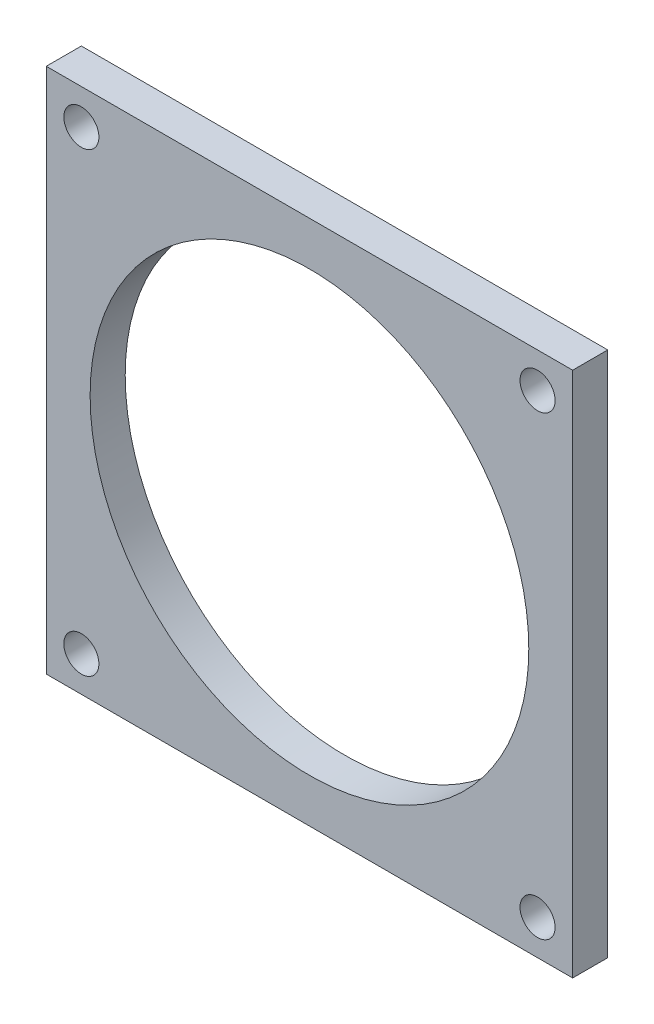
ISO-10303-21;
HEADER;
FILE_DESCRIPTION(('STEP AP214'),'2;1');
FILE_NAME('part.step','',(''),(''),'','','');
FILE_SCHEMA(('AUTOMOTIVE_DESIGN { 1 0 10303 214 1 1 1 1 }'));
ENDSEC;
DATA;
#1=APPLICATION_CONTEXT('core data for automotive mechanical design processes');
#2=APPLICATION_PROTOCOL_DEFINITION('international standard','automotive_design',2000,#1);
#3=PRODUCT_CONTEXT('',#1,'mechanical');
#4=PRODUCT('Part','Part','',(#3));
#5=PRODUCT_RELATED_PRODUCT_CATEGORY('part','',(#4));
#6=PRODUCT_DEFINITION_FORMATION('','',#4);
#7=PRODUCT_DEFINITION_CONTEXT('part definition',#1,'design');
#8=PRODUCT_DEFINITION('design','',#6,#7);
#9=PRODUCT_DEFINITION_SHAPE('','',#8);
#10=(LENGTH_UNIT() NAMED_UNIT(*) SI_UNIT(.MILLI.,.METRE.));
#11=(NAMED_UNIT(*) PLANE_ANGLE_UNIT() SI_UNIT($,.RADIAN.));
#12=(NAMED_UNIT(*) SI_UNIT($,.STERADIAN.) SOLID_ANGLE_UNIT());
#13=UNCERTAINTY_MEASURE_WITH_UNIT(LENGTH_MEASURE(1.E-05),#10,'distance_accuracy_value','');
#14=(GEOMETRIC_REPRESENTATION_CONTEXT(3) GLOBAL_UNCERTAINTY_ASSIGNED_CONTEXT((#13)) GLOBAL_UNIT_ASSIGNED_CONTEXT((#10,
#11,#12)) REPRESENTATION_CONTEXT('',''));
#15=CARTESIAN_POINT('',(0.,0.,0.));
#16=DIRECTION('',(0.,0.,1.));
#17=DIRECTION('',(1.,0.,0.));
#18=AXIS2_PLACEMENT_3D('',#15,#16,#17);
#19=CARTESIAN_POINT('',(-19.05,-19.05,2.54));
#20=DIRECTION('',(1.,0.,0.));
#21=DIRECTION('',(0.,0.,-1.));
#22=AXIS2_PLACEMENT_3D('',#19,#20,#21);
#23=PLANE('',#22);
#24=DIRECTION('',(0.,-1.,0.));
#25=VECTOR('',#24,1.);
#26=CARTESIAN_POINT('',(-19.05,-19.05,0.));
#27=LINE('',#26,#25);
#28=CARTESIAN_POINT('',(-19.05,19.05,0.));
#29=VERTEX_POINT('',#28);
#30=CARTESIAN_POINT('',(-19.05,-19.05,0.));
#31=VERTEX_POINT('',#30);
#32=EDGE_CURVE('E96',#29,#31,#27,.T.);
#33=ORIENTED_EDGE('',*,*,#32,.T.);
#34=DIRECTION('',(0.,0.,-1.));
#35=VECTOR('',#34,1.);
#36=CARTESIAN_POINT('',(-19.05,-19.05,2.54));
#37=LINE('',#36,#35);
#38=CARTESIAN_POINT('',(-19.05,-19.05,2.54));
#39=VERTEX_POINT('',#38);
#40=EDGE_CURVE('E11',#39,#31,#37,.T.);
#41=ORIENTED_EDGE('',*,*,#40,.F.);
#42=DIRECTION('',(0.,-1.,0.));
#43=VECTOR('',#42,1.);
#44=CARTESIAN_POINT('',(-19.05,-19.05,2.54));
#45=LINE('',#44,#43);
#46=CARTESIAN_POINT('',(-19.05,19.05,2.54));
#47=VERTEX_POINT('',#46);
#48=EDGE_CURVE('E84',#47,#39,#45,.T.);
#49=ORIENTED_EDGE('',*,*,#48,.F.);
#50=DIRECTION('',(0.,0.,-1.));
#51=VECTOR('',#50,1.);
#52=CARTESIAN_POINT('',(-19.05,19.05,2.54));
#53=LINE('',#52,#51);
#54=EDGE_CURVE('E92',#47,#29,#53,.T.);
#55=ORIENTED_EDGE('',*,*,#54,.T.);
#56=EDGE_LOOP('',(#33,#41,#49,#55));
#57=FACE_BOUND('',#56,.T.);
#58=ADVANCED_FACE('F33',(#57),#23,.F.);
#59=CARTESIAN_POINT('',(19.05,-19.05,2.54));
#60=DIRECTION('',(0.,1.,0.));
#61=DIRECTION('',(0.,0.,1.));
#62=AXIS2_PLACEMENT_3D('',#59,#60,#61);
#63=PLANE('',#62);
#64=DIRECTION('',(1.,0.,0.));
#65=VECTOR('',#64,1.);
#66=CARTESIAN_POINT('',(19.05,-19.05,0.));
#67=LINE('',#66,#65);
#68=CARTESIAN_POINT('',(19.05,-19.05,0.));
#69=VERTEX_POINT('',#68);
#70=EDGE_CURVE('E88',#31,#69,#67,.T.);
#71=ORIENTED_EDGE('',*,*,#70,.T.);
#72=DIRECTION('',(0.,0.,-1.));
#73=VECTOR('',#72,1.);
#74=CARTESIAN_POINT('',(19.05,-19.05,2.54));
#75=LINE('',#74,#73);
#76=CARTESIAN_POINT('',(19.05,-19.05,2.54));
#77=VERTEX_POINT('',#76);
#78=EDGE_CURVE('E41',#77,#69,#75,.T.);
#79=ORIENTED_EDGE('',*,*,#78,.F.);
#80=DIRECTION('',(1.,0.,0.));
#81=VECTOR('',#80,1.);
#82=CARTESIAN_POINT('',(19.05,-19.05,2.54));
#83=LINE('',#82,#81);
#84=EDGE_CURVE('E79',#39,#77,#83,.T.);
#85=ORIENTED_EDGE('',*,*,#84,.F.);
#86=ORIENTED_EDGE('',*,*,#40,.T.);
#87=EDGE_LOOP('',(#71,#79,#85,#86));
#88=FACE_BOUND('',#87,.T.);
#89=ADVANCED_FACE('F87',(#88),#63,.F.);
#90=CARTESIAN_POINT('',(19.05,19.05,2.54));
#91=DIRECTION('',(-1.,0.,0.));
#92=DIRECTION('',(0.,0.,1.));
#93=AXIS2_PLACEMENT_3D('',#90,#91,#92);
#94=PLANE('',#93);
#95=DIRECTION('',(0.,1.,0.));
#96=VECTOR('',#95,1.);
#97=CARTESIAN_POINT('',(19.05,19.05,0.));
#98=LINE('',#97,#96);
#99=CARTESIAN_POINT('',(19.05,19.05,0.));
#100=VERTEX_POINT('',#99);
#101=EDGE_CURVE('E66',#69,#100,#98,.T.);
#102=ORIENTED_EDGE('',*,*,#101,.T.);
#103=DIRECTION('',(0.,0.,-1.));
#104=VECTOR('',#103,1.);
#105=CARTESIAN_POINT('',(19.05,19.05,2.54));
#106=LINE('',#105,#104);
#107=CARTESIAN_POINT('',(19.05,19.05,2.54));
#108=VERTEX_POINT('',#107);
#109=EDGE_CURVE('E89',#108,#100,#106,.T.);
#110=ORIENTED_EDGE('',*,*,#109,.F.);
#111=DIRECTION('',(0.,1.,0.));
#112=VECTOR('',#111,1.);
#113=CARTESIAN_POINT('',(19.05,19.05,2.54));
#114=LINE('',#113,#112);
#115=EDGE_CURVE('E82',#77,#108,#114,.T.);
#116=ORIENTED_EDGE('',*,*,#115,.F.);
#117=ORIENTED_EDGE('',*,*,#78,.T.);
#118=EDGE_LOOP('',(#102,#110,#116,#117));
#119=FACE_BOUND('',#118,.T.);
#120=ADVANCED_FACE('F90',(#119),#94,.F.);
#121=CARTESIAN_POINT('',(-19.05,19.05,2.54));
#122=DIRECTION('',(0.,-1.,0.));
#123=DIRECTION('',(1.,0.,0.));
#124=AXIS2_PLACEMENT_3D('',#121,#122,#123);
#125=PLANE('',#124);
#126=DIRECTION('',(-1.,0.,0.));
#127=VECTOR('',#126,1.);
#128=CARTESIAN_POINT('',(-19.05,19.05,0.));
#129=LINE('',#128,#127);
#130=EDGE_CURVE('E72',#100,#29,#129,.T.);
#131=ORIENTED_EDGE('',*,*,#130,.T.);
#132=ORIENTED_EDGE('',*,*,#54,.F.);
#133=DIRECTION('',(-1.,0.,0.));
#134=VECTOR('',#133,1.);
#135=CARTESIAN_POINT('',(-19.05,19.05,2.54));
#136=LINE('',#135,#134);
#137=EDGE_CURVE('E49',#108,#47,#136,.T.);
#138=ORIENTED_EDGE('',*,*,#137,.F.);
#139=ORIENTED_EDGE('',*,*,#109,.T.);
#140=EDGE_LOOP('',(#131,#132,#138,#139));
#141=FACE_BOUND('',#140,.T.);
#142=ADVANCED_FACE('F104',(#141),#125,.F.);
#143=CARTESIAN_POINT('',(0.,0.,2.54));
#144=DIRECTION('',(0.,0.,-1.));
#145=DIRECTION('',(-1.,0.,0.));
#146=AXIS2_PLACEMENT_3D('',#143,#144,#145);
#147=PLANE('',#146);
#148=CARTESIAN_POINT('',(-16.51,-16.51,2.54));
#149=DIRECTION('',(0.,0.,1.));
#150=DIRECTION('',(-1.,0.,0.));
#151=AXIS2_PLACEMENT_3D('',#148,#149,#150);
#152=CIRCLE('',#151,1.27);
#153=CARTESIAN_POINT('',(-17.78,-16.51,2.54));
#154=VERTEX_POINT('',#153);
#155=EDGE_CURVE('E122',#154,#154,#152,.T.);
#156=ORIENTED_EDGE('',*,*,#155,.F.);
#157=EDGE_LOOP('',(#156));
#158=FACE_BOUND('',#157,.T.);
#159=CARTESIAN_POINT('',(16.51,-16.51,2.54));
#160=DIRECTION('',(0.,0.,1.));
#161=DIRECTION('',(1.,0.,0.));
#162=AXIS2_PLACEMENT_3D('',#159,#160,#161);
#163=CIRCLE('',#162,1.27);
#164=CARTESIAN_POINT('',(17.78,-16.51,2.54));
#165=VERTEX_POINT('',#164);
#166=EDGE_CURVE('E128',#165,#165,#163,.T.);
#167=ORIENTED_EDGE('',*,*,#166,.F.);
#168=EDGE_LOOP('',(#167));
#169=FACE_BOUND('',#168,.T.);
#170=CARTESIAN_POINT('',(16.51,16.51,2.54));
#171=DIRECTION('',(0.,0.,1.));
#172=DIRECTION('',(-1.,0.,0.));
#173=AXIS2_PLACEMENT_3D('',#170,#171,#172);
#174=CIRCLE('',#173,1.27);
#175=CARTESIAN_POINT('',(15.24,16.51,2.54));
#176=VERTEX_POINT('',#175);
#177=EDGE_CURVE('E134',#176,#176,#174,.T.);
#178=ORIENTED_EDGE('',*,*,#177,.F.);
#179=EDGE_LOOP('',(#178));
#180=FACE_BOUND('',#179,.T.);
#181=CARTESIAN_POINT('',(-16.51,16.51,2.54));
#182=DIRECTION('',(0.,0.,1.));
#183=DIRECTION('',(1.,0.,0.));
#184=AXIS2_PLACEMENT_3D('',#181,#182,#183);
#185=CIRCLE('',#184,1.27);
#186=CARTESIAN_POINT('',(-15.24,16.51,2.54));
#187=VERTEX_POINT('',#186);
#188=EDGE_CURVE('E116',#187,#187,#185,.T.);
#189=ORIENTED_EDGE('',*,*,#188,.F.);
#190=EDGE_LOOP('',(#189));
#191=FACE_BOUND('',#190,.T.);
#192=CARTESIAN_POINT('',(0.,0.,2.54));
#193=DIRECTION('',(0.,0.,-1.));
#194=DIRECTION('',(-1.,0.,0.));
#195=AXIS2_PLACEMENT_3D('',#192,#193,#194);
#196=CIRCLE('',#195,15.875);
#197=CARTESIAN_POINT('',(-15.875,0.,2.54));
#198=VERTEX_POINT('',#197);
#199=EDGE_CURVE('E99',#198,#198,#196,.T.);
#200=ORIENTED_EDGE('',*,*,#199,.T.);
#201=EDGE_LOOP('',(#200));
#202=FACE_BOUND('',#201,.T.);
#203=ORIENTED_EDGE('',*,*,#48,.T.);
#204=ORIENTED_EDGE('',*,*,#84,.T.);
#205=ORIENTED_EDGE('',*,*,#115,.T.);
#206=ORIENTED_EDGE('',*,*,#137,.T.);
#207=EDGE_LOOP('',(#203,#204,#205,#206));
#208=FACE_BOUND('',#207,.T.);
#209=ADVANCED_FACE('F80',(#158,#169,#180,#191,#202,#208),#147,.F.);
#210=CARTESIAN_POINT('',(0.,0.,0.));
#211=DIRECTION('',(0.,0.,-1.));
#212=DIRECTION('',(-1.,0.,0.));
#213=AXIS2_PLACEMENT_3D('',#210,#211,#212);
#214=PLANE('',#213);
#215=CARTESIAN_POINT('',(-16.51,-16.51,0.));
#216=DIRECTION('',(0.,0.,1.));
#217=DIRECTION('',(-1.,0.,0.));
#218=AXIS2_PLACEMENT_3D('',#215,#216,#217);
#219=CIRCLE('',#218,1.27);
#220=CARTESIAN_POINT('',(-17.78,-16.51,0.));
#221=VERTEX_POINT('',#220);
#222=EDGE_CURVE('E125',#221,#221,#219,.T.);
#223=ORIENTED_EDGE('',*,*,#222,.T.);
#224=EDGE_LOOP('',(#223));
#225=FACE_BOUND('',#224,.T.);
#226=CARTESIAN_POINT('',(16.51,-16.51,0.));
#227=DIRECTION('',(0.,0.,1.));
#228=DIRECTION('',(1.,0.,0.));
#229=AXIS2_PLACEMENT_3D('',#226,#227,#228);
#230=CIRCLE('',#229,1.27);
#231=CARTESIAN_POINT('',(17.78,-16.51,0.));
#232=VERTEX_POINT('',#231);
#233=EDGE_CURVE('E131',#232,#232,#230,.T.);
#234=ORIENTED_EDGE('',*,*,#233,.T.);
#235=EDGE_LOOP('',(#234));
#236=FACE_BOUND('',#235,.T.);
#237=CARTESIAN_POINT('',(16.51,16.51,0.));
#238=DIRECTION('',(0.,0.,1.));
#239=DIRECTION('',(-1.,0.,0.));
#240=AXIS2_PLACEMENT_3D('',#237,#238,#239);
#241=CIRCLE('',#240,1.27);
#242=CARTESIAN_POINT('',(15.24,16.51,0.));
#243=VERTEX_POINT('',#242);
#244=EDGE_CURVE('E119',#243,#243,#241,.T.);
#245=ORIENTED_EDGE('',*,*,#244,.T.);
#246=EDGE_LOOP('',(#245));
#247=FACE_BOUND('',#246,.T.);
#248=CARTESIAN_POINT('',(-16.51,16.51,0.));
#249=DIRECTION('',(0.,0.,1.));
#250=DIRECTION('',(1.,0.,0.));
#251=AXIS2_PLACEMENT_3D('',#248,#249,#250);
#252=CIRCLE('',#251,1.27);
#253=CARTESIAN_POINT('',(-15.24,16.51,0.));
#254=VERTEX_POINT('',#253);
#255=EDGE_CURVE('E115',#254,#254,#252,.T.);
#256=ORIENTED_EDGE('',*,*,#255,.T.);
#257=EDGE_LOOP('',(#256));
#258=FACE_BOUND('',#257,.T.);
#259=CARTESIAN_POINT('',(0.,0.,0.));
#260=DIRECTION('',(0.,0.,1.));
#261=DIRECTION('',(1.,0.,0.));
#262=AXIS2_PLACEMENT_3D('',#259,#260,#261);
#263=CIRCLE('',#262,15.875);
#264=CARTESIAN_POINT('',(15.875,0.,0.));
#265=VERTEX_POINT('',#264);
#266=EDGE_CURVE('E112',#265,#265,#263,.T.);
#267=ORIENTED_EDGE('',*,*,#266,.T.);
#268=EDGE_LOOP('',(#267));
#269=FACE_BOUND('',#268,.T.);
#270=ORIENTED_EDGE('',*,*,#32,.F.);
#271=ORIENTED_EDGE('',*,*,#130,.F.);
#272=ORIENTED_EDGE('',*,*,#101,.F.);
#273=ORIENTED_EDGE('',*,*,#70,.F.);
#274=EDGE_LOOP('',(#270,#271,#272,#273));
#275=FACE_BOUND('',#274,.T.);
#276=ADVANCED_FACE('F107',(#225,#236,#247,#258,#269,#275),#214,.T.);
#277=CARTESIAN_POINT('',(0.,0.,0.));
#278=DIRECTION('',(0.,0.,1.));
#279=DIRECTION('',(1.,0.,0.));
#280=AXIS2_PLACEMENT_3D('',#277,#278,#279);
#281=CYLINDRICAL_SURFACE('',#280,15.875);
#282=ORIENTED_EDGE('',*,*,#266,.F.);
#283=EDGE_LOOP('',(#282));
#284=FACE_BOUND('',#283,.T.);
#285=ORIENTED_EDGE('',*,*,#199,.F.);
#286=EDGE_LOOP('',(#285));
#287=FACE_BOUND('',#286,.T.);
#288=ADVANCED_FACE('F158',(#284,#287),#281,.F.);
#289=CARTESIAN_POINT('',(-16.51,16.51,0.));
#290=DIRECTION('',(0.,0.,1.));
#291=DIRECTION('',(1.,0.,0.));
#292=AXIS2_PLACEMENT_3D('',#289,#290,#291);
#293=CYLINDRICAL_SURFACE('',#292,1.27);
#294=ORIENTED_EDGE('',*,*,#255,.F.);
#295=EDGE_LOOP('',(#294));
#296=FACE_BOUND('',#295,.T.);
#297=ORIENTED_EDGE('',*,*,#188,.T.);
#298=EDGE_LOOP('',(#297));
#299=FACE_BOUND('',#298,.T.);
#300=ADVANCED_FACE('F146',(#296,#299),#293,.F.);
#301=CARTESIAN_POINT('',(16.51,16.51,0.));
#302=DIRECTION('',(0.,0.,1.));
#303=DIRECTION('',(1.,0.,0.));
#304=AXIS2_PLACEMENT_3D('',#301,#302,#303);
#305=CYLINDRICAL_SURFACE('',#304,1.27);
#306=ORIENTED_EDGE('',*,*,#244,.F.);
#307=EDGE_LOOP('',(#306));
#308=FACE_BOUND('',#307,.T.);
#309=ORIENTED_EDGE('',*,*,#177,.T.);
#310=EDGE_LOOP('',(#309));
#311=FACE_BOUND('',#310,.T.);
#312=ADVANCED_FACE('F142',(#308,#311),#305,.F.);
#313=CARTESIAN_POINT('',(16.51,-16.51,0.));
#314=DIRECTION('',(0.,0.,1.));
#315=DIRECTION('',(1.,0.,0.));
#316=AXIS2_PLACEMENT_3D('',#313,#314,#315);
#317=CYLINDRICAL_SURFACE('',#316,1.27);
#318=ORIENTED_EDGE('',*,*,#233,.F.);
#319=EDGE_LOOP('',(#318));
#320=FACE_BOUND('',#319,.T.);
#321=ORIENTED_EDGE('',*,*,#166,.T.);
#322=EDGE_LOOP('',(#321));
#323=FACE_BOUND('',#322,.T.);
#324=ADVANCED_FACE('F145',(#320,#323),#317,.F.);
#325=CARTESIAN_POINT('',(-16.51,-16.51,0.));
#326=DIRECTION('',(0.,0.,1.));
#327=DIRECTION('',(1.,0.,0.));
#328=AXIS2_PLACEMENT_3D('',#325,#326,#327);
#329=CYLINDRICAL_SURFACE('',#328,1.27);
#330=ORIENTED_EDGE('',*,*,#222,.F.);
#331=EDGE_LOOP('',(#330));
#332=FACE_BOUND('',#331,.T.);
#333=ORIENTED_EDGE('',*,*,#155,.T.);
#334=EDGE_LOOP('',(#333));
#335=FACE_BOUND('',#334,.T.);
#336=ADVANCED_FACE('F217',(#332,#335),#329,.F.);
#337=CLOSED_SHELL('',(#58,#89,#120,#142,#209,#276,#288,#300,#312,#324,#336));
#338=MANIFOLD_SOLID_BREP('B2',#337);
#339=ADVANCED_BREP_SHAPE_REPRESENTATION('',(#18,#338),#14);
#340=SHAPE_DEFINITION_REPRESENTATION(#9,#339);
ENDSEC;
END-ISO-10303-21;
